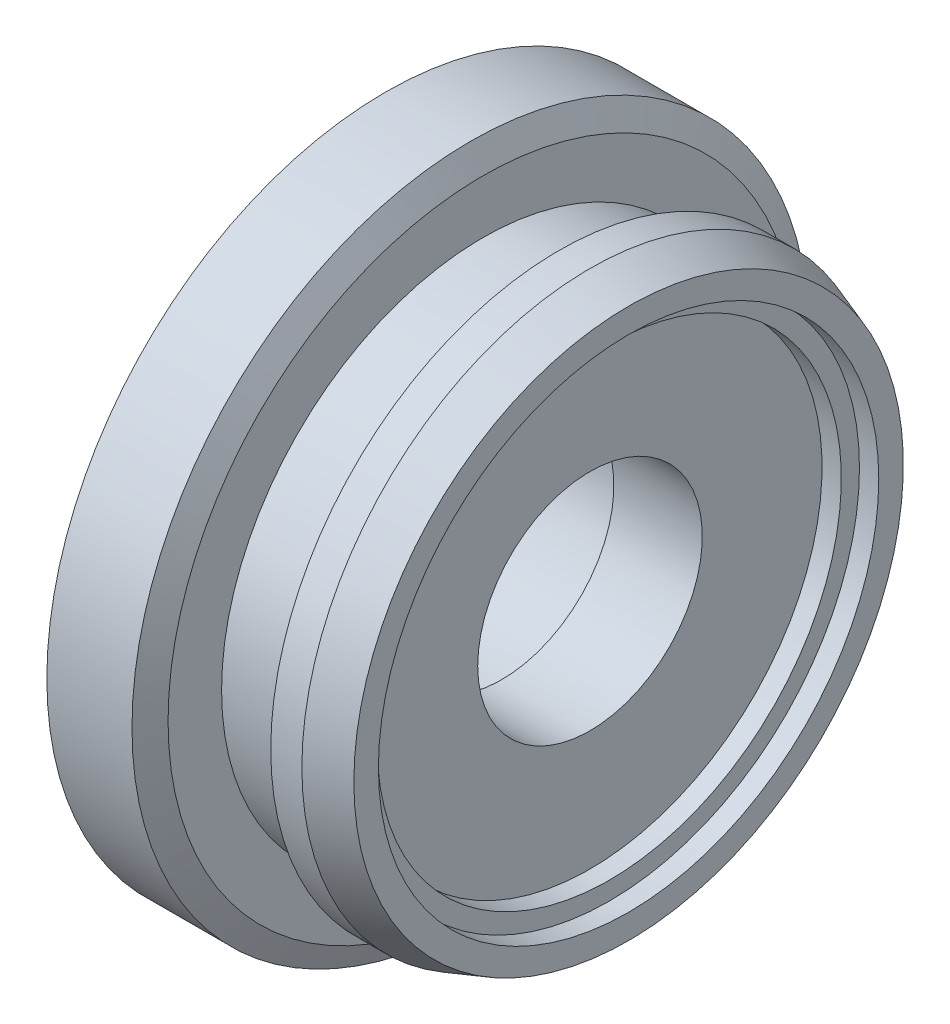
ISO-10303-21;
HEADER;
FILE_DESCRIPTION(('STEP AP214'),'2;1');
FILE_NAME('part.step','',(''),(''),'','','');
FILE_SCHEMA(('AUTOMOTIVE_DESIGN { 1 0 10303 214 1 1 1 1 }'));
ENDSEC;
DATA;
#1=APPLICATION_CONTEXT('core data for automotive mechanical design processes');
#2=APPLICATION_PROTOCOL_DEFINITION('international standard','automotive_design',2000,#1);
#3=PRODUCT_CONTEXT('',#1,'mechanical');
#4=PRODUCT('Part','Part','',(#3));
#5=PRODUCT_RELATED_PRODUCT_CATEGORY('part','',(#4));
#6=PRODUCT_DEFINITION_FORMATION('','',#4);
#7=PRODUCT_DEFINITION_CONTEXT('part definition',#1,'design');
#8=PRODUCT_DEFINITION('design','',#6,#7);
#9=PRODUCT_DEFINITION_SHAPE('','',#8);
#10=(LENGTH_UNIT() NAMED_UNIT(*) SI_UNIT(.MILLI.,.METRE.));
#11=(NAMED_UNIT(*) PLANE_ANGLE_UNIT() SI_UNIT($,.RADIAN.));
#12=(NAMED_UNIT(*) SI_UNIT($,.STERADIAN.) SOLID_ANGLE_UNIT());
#13=UNCERTAINTY_MEASURE_WITH_UNIT(LENGTH_MEASURE(1.E-05),#10,'distance_accuracy_value','');
#14=(GEOMETRIC_REPRESENTATION_CONTEXT(3) GLOBAL_UNCERTAINTY_ASSIGNED_CONTEXT((#13)) GLOBAL_UNIT_ASSIGNED_CONTEXT((#10,
#11,#12)) REPRESENTATION_CONTEXT('',''));
#15=CARTESIAN_POINT('',(0.,0.,0.));
#16=DIRECTION('',(0.,0.,1.));
#17=DIRECTION('',(1.,0.,0.));
#18=AXIS2_PLACEMENT_3D('',#15,#16,#17);
#19=CARTESIAN_POINT('',(0.,0.,0.));
#20=DIRECTION('',(-1.,0.,0.));
#21=DIRECTION('',(0.,0.,1.));
#22=AXIS2_PLACEMENT_3D('',#19,#20,#21);
#23=CYLINDRICAL_SURFACE('',#22,72.3211822660099);
#24=CARTESIAN_POINT('',(-3.51851386497515,0.,0.));
#25=DIRECTION('',(-1.,0.,0.));
#26=DIRECTION('',(0.,0.,1.));
#27=AXIS2_PLACEMENT_3D('',#24,#25,#26);
#28=CIRCLE('',#27,72.3211822660099);
#29=CARTESIAN_POINT('',(-3.51851386497515,0.,72.3211822660099));
#30=VERTEX_POINT('',#29);
#31=EDGE_CURVE('E81',#30,#30,#28,.T.);
#32=ORIENTED_EDGE('',*,*,#31,.F.);
#33=EDGE_LOOP('',(#32));
#34=FACE_BOUND('',#33,.T.);
#35=CARTESIAN_POINT('',(14.6638008523828,0.,0.));
#36=DIRECTION('',(-1.,0.,0.));
#37=DIRECTION('',(0.,0.,1.));
#38=AXIS2_PLACEMENT_3D('',#35,#36,#37);
#39=CIRCLE('',#38,72.3211822660099);
#40=CARTESIAN_POINT('',(14.6638008523828,0.,72.3211822660099));
#41=VERTEX_POINT('',#40);
#42=EDGE_CURVE('E10',#41,#41,#39,.T.);
#43=ORIENTED_EDGE('',*,*,#42,.T.);
#44=EDGE_LOOP('',(#43));
#45=FACE_BOUND('',#44,.T.);
#46=ADVANCED_FACE('F29',(#34,#45),#23,.T.);
#47=CARTESIAN_POINT('',(17.3226678474567,0.,0.));
#48=DIRECTION('',(-1.,0.,0.));
#49=DIRECTION('',(0.,0.,1.));
#50=AXIS2_PLACEMENT_3D('',#47,#48,#49);
#51=CONICAL_SURFACE('',#50,67.2693349753695,1.08631839775787);
#52=ORIENTED_EDGE('',*,*,#42,.F.);
#53=EDGE_LOOP('',(#52));
#54=FACE_BOUND('',#53,.T.);
#55=CARTESIAN_POINT('',(17.3226678474567,0.,0.));
#56=DIRECTION('',(-1.,0.,0.));
#57=DIRECTION('',(0.,0.,1.));
#58=AXIS2_PLACEMENT_3D('',#55,#56,#57);
#59=CIRCLE('',#58,67.2693349753695);
#60=CARTESIAN_POINT('',(17.3226678474567,0.,67.2693349753695));
#61=VERTEX_POINT('',#60);
#62=EDGE_CURVE('E35',#61,#61,#59,.T.);
#63=ORIENTED_EDGE('',*,*,#62,.T.);
#64=EDGE_LOOP('',(#63));
#65=FACE_BOUND('',#64,.T.);
#66=ADVANCED_FACE('F88',(#54,#65),#51,.T.);
#67=CARTESIAN_POINT('',(17.3226678474567,67.2693349753695,0.));
#68=DIRECTION('',(-1.,0.,0.));
#69=DIRECTION('',(0.,0.,1.));
#70=AXIS2_PLACEMENT_3D('',#67,#68,#69);
#71=PLANE('',#70);
#72=ORIENTED_EDGE('',*,*,#62,.F.);
#73=EDGE_LOOP('',(#72));
#74=FACE_BOUND('',#73,.T.);
#75=CARTESIAN_POINT('',(17.3226678474567,0.,0.));
#76=DIRECTION('',(-1.,0.,0.));
#77=DIRECTION('',(0.,0.,1.));
#78=AXIS2_PLACEMENT_3D('',#75,#76,#77);
#79=CIRCLE('',#78,55.8362068965517);
#80=CARTESIAN_POINT('',(17.3226678474567,0.,55.8362068965517));
#81=VERTEX_POINT('',#80);
#82=EDGE_CURVE('E39',#81,#81,#79,.T.);
#83=ORIENTED_EDGE('',*,*,#82,.T.);
#84=EDGE_LOOP('',(#83));
#85=FACE_BOUND('',#84,.T.);
#86=ADVANCED_FACE('F92',(#74,#85),#71,.F.);
#87=CARTESIAN_POINT('',(0.,0.,0.));
#88=DIRECTION('',(-1.,0.,0.));
#89=DIRECTION('',(0.,0.,1.));
#90=AXIS2_PLACEMENT_3D('',#87,#88,#89);
#91=CYLINDRICAL_SURFACE('',#90,55.8362068965517);
#92=ORIENTED_EDGE('',*,*,#82,.F.);
#93=EDGE_LOOP('',(#92));
#94=FACE_BOUND('',#93,.T.);
#95=CARTESIAN_POINT('',(33.5417565174074,0.,0.));
#96=DIRECTION('',(-1.,0.,0.));
#97=DIRECTION('',(0.,0.,1.));
#98=AXIS2_PLACEMENT_3D('',#95,#96,#97);
#99=CIRCLE('',#98,55.8362068965517);
#100=CARTESIAN_POINT('',(33.5417565174074,0.,55.8362068965517));
#101=VERTEX_POINT('',#100);
#102=EDGE_CURVE('E43',#101,#101,#99,.T.);
#103=ORIENTED_EDGE('',*,*,#102,.T.);
#104=EDGE_LOOP('',(#103));
#105=FACE_BOUND('',#104,.T.);
#106=ADVANCED_FACE('F97',(#94,#105),#91,.T.);
#107=CARTESIAN_POINT('',(33.5417565174074,55.8362068965517,0.));
#108=DIRECTION('',(1.,0.,0.));
#109=DIRECTION('',(0.,0.,-1.));
#110=AXIS2_PLACEMENT_3D('',#107,#108,#109);
#111=PLANE('',#110);
#112=ORIENTED_EDGE('',*,*,#102,.F.);
#113=EDGE_LOOP('',(#112));
#114=FACE_BOUND('',#113,.T.);
#115=CARTESIAN_POINT('',(33.5417565174074,0.,0.));
#116=DIRECTION('',(-1.,0.,0.));
#117=DIRECTION('',(0.,0.,1.));
#118=AXIS2_PLACEMENT_3D('',#115,#116,#117);
#119=CIRCLE('',#118,61.5527709359606);
#120=CARTESIAN_POINT('',(33.5417565174074,0.,61.5527709359606));
#121=VERTEX_POINT('',#120);
#122=EDGE_CURVE('E48',#121,#121,#119,.T.);
#123=ORIENTED_EDGE('',*,*,#122,.T.);
#124=EDGE_LOOP('',(#123));
#125=FACE_BOUND('',#124,.T.);
#126=ADVANCED_FACE('F103',(#114,#125),#111,.F.);
#127=CARTESIAN_POINT('',(0.,0.,0.));
#128=DIRECTION('',(-1.,0.,0.));
#129=DIRECTION('',(0.,0.,1.));
#130=AXIS2_PLACEMENT_3D('',#127,#128,#129);
#131=CYLINDRICAL_SURFACE('',#130,61.5527709359606);
#132=ORIENTED_EDGE('',*,*,#122,.F.);
#133=EDGE_LOOP('',(#132));
#134=FACE_BOUND('',#133,.T.);
#135=CARTESIAN_POINT('',(40.1889240050922,0.,0.));
#136=DIRECTION('',(-1.,0.,0.));
#137=DIRECTION('',(0.,0.,1.));
#138=AXIS2_PLACEMENT_3D('',#135,#136,#137);
#139=CIRCLE('',#138,61.5527709359606);
#140=CARTESIAN_POINT('',(40.1889240050922,0.,61.5527709359606));
#141=VERTEX_POINT('',#140);
#142=EDGE_CURVE('E51',#141,#141,#139,.T.);
#143=ORIENTED_EDGE('',*,*,#142,.T.);
#144=EDGE_LOOP('',(#143));
#145=FACE_BOUND('',#144,.T.);
#146=ADVANCED_FACE('F107',(#134,#145),#131,.T.);
#147=CARTESIAN_POINT('',(48.4314116898212,0.,0.));
#148=DIRECTION('',(-1.,0.,0.));
#149=DIRECTION('',(0.,0.,1.));
#150=AXIS2_PLACEMENT_3D('',#147,#148,#149);
#151=CONICAL_SURFACE('',#150,58.6944889162562,0.333798164250827);
#152=ORIENTED_EDGE('',*,*,#142,.F.);
#153=EDGE_LOOP('',(#152));
#154=FACE_BOUND('',#153,.T.);
#155=CARTESIAN_POINT('',(48.4314116898212,0.,0.));
#156=DIRECTION('',(-1.,0.,0.));
#157=DIRECTION('',(0.,0.,1.));
#158=AXIS2_PLACEMENT_3D('',#155,#156,#157);
#159=CIRCLE('',#158,58.6944889162562);
#160=CARTESIAN_POINT('',(48.4314116898212,0.,58.6944889162562));
#161=VERTEX_POINT('',#160);
#162=EDGE_CURVE('E54',#161,#161,#159,.T.);
#163=ORIENTED_EDGE('',*,*,#162,.T.);
#164=EDGE_LOOP('',(#163));
#165=FACE_BOUND('',#164,.T.);
#166=ADVANCED_FACE('F111',(#154,#165),#151,.T.);
#167=CARTESIAN_POINT('',(48.4314116898212,58.6944889162562,0.));
#168=DIRECTION('',(-1.,0.,0.));
#169=DIRECTION('',(0.,0.,1.));
#170=AXIS2_PLACEMENT_3D('',#167,#168,#169);
#171=PLANE('',#170);
#172=ORIENTED_EDGE('',*,*,#162,.F.);
#173=EDGE_LOOP('',(#172));
#174=FACE_BOUND('',#173,.T.);
#175=CARTESIAN_POINT('',(48.4314116898212,0.,0.));
#176=DIRECTION('',(-1.,0.,0.));
#177=DIRECTION('',(0.,0.,1.));
#178=AXIS2_PLACEMENT_3D('',#175,#176,#177);
#179=CIRCLE('',#178,53.4432266009852);
#180=CARTESIAN_POINT('',(48.4314116898212,0.,53.4432266009852));
#181=VERTEX_POINT('',#180);
#182=EDGE_CURVE('E57',#181,#181,#179,.T.);
#183=ORIENTED_EDGE('',*,*,#182,.T.);
#184=EDGE_LOOP('',(#183));
#185=FACE_BOUND('',#184,.T.);
#186=ADVANCED_FACE('F115',(#174,#185),#171,.F.);
#187=CARTESIAN_POINT('',(0.,0.,0.));
#188=DIRECTION('',(-1.,0.,0.));
#189=DIRECTION('',(0.,0.,1.));
#190=AXIS2_PLACEMENT_3D('',#187,#188,#189);
#191=CYLINDRICAL_SURFACE('',#190,53.4432266009852);
#192=ORIENTED_EDGE('',*,*,#182,.F.);
#193=EDGE_LOOP('',(#192));
#194=FACE_BOUND('',#193,.T.);
#195=CARTESIAN_POINT('',(44.3101678474567,0.,0.));
#196=DIRECTION('',(-1.,0.,0.));
#197=DIRECTION('',(0.,0.,1.));
#198=AXIS2_PLACEMENT_3D('',#195,#196,#197);
#199=CIRCLE('',#198,53.4432266009852);
#200=CARTESIAN_POINT('',(44.3101678474567,0.,53.4432266009852));
#201=VERTEX_POINT('',#200);
#202=EDGE_CURVE('E60',#201,#201,#199,.T.);
#203=ORIENTED_EDGE('',*,*,#202,.T.);
#204=EDGE_LOOP('',(#203));
#205=FACE_BOUND('',#204,.T.);
#206=ADVANCED_FACE('F119',(#194,#205),#191,.F.);
#207=CARTESIAN_POINT('',(44.3101678474567,53.4432266009852,0.));
#208=DIRECTION('',(-1.,0.,0.));
#209=DIRECTION('',(0.,0.,1.));
#210=AXIS2_PLACEMENT_3D('',#207,#208,#209);
#211=PLANE('',#210);
#212=ORIENTED_EDGE('',*,*,#202,.F.);
#213=EDGE_LOOP('',(#212));
#214=FACE_BOUND('',#213,.T.);
#215=CARTESIAN_POINT('',(44.3101678474567,0.,0.));
#216=DIRECTION('',(-1.,0.,0.));
#217=DIRECTION('',(0.,0.,1.));
#218=AXIS2_PLACEMENT_3D('',#215,#216,#217);
#219=CIRCLE('',#218,49.5683393946803);
#220=CARTESIAN_POINT('',(44.3101678474567,0.,49.5683393946803));
#221=VERTEX_POINT('',#220);
#222=EDGE_CURVE('E63',#221,#221,#219,.T.);
#223=ORIENTED_EDGE('',*,*,#222,.T.);
#224=EDGE_LOOP('',(#223));
#225=FACE_BOUND('',#224,.T.);
#226=ADVANCED_FACE('F123',(#214,#225),#211,.F.);
#227=CARTESIAN_POINT('',(0.,0.,0.));
#228=DIRECTION('',(-1.,0.,0.));
#229=DIRECTION('',(0.,0.,1.));
#230=AXIS2_PLACEMENT_3D('',#227,#228,#229);
#231=CYLINDRICAL_SURFACE('',#230,49.5683393946803);
#232=ORIENTED_EDGE('',*,*,#222,.F.);
#233=EDGE_LOOP('',(#232));
#234=FACE_BOUND('',#233,.T.);
#235=CARTESIAN_POINT('',(40.1889240050922,0.,0.));
#236=DIRECTION('',(-1.,0.,0.));
#237=DIRECTION('',(0.,0.,1.));
#238=AXIS2_PLACEMENT_3D('',#235,#236,#237);
#239=CIRCLE('',#238,49.5683393946803);
#240=CARTESIAN_POINT('',(40.1889240050922,0.,49.5683393946803));
#241=VERTEX_POINT('',#240);
#242=EDGE_CURVE('E66',#241,#241,#239,.T.);
#243=ORIENTED_EDGE('',*,*,#242,.T.);
#244=EDGE_LOOP('',(#243));
#245=FACE_BOUND('',#244,.T.);
#246=ADVANCED_FACE('F127',(#234,#245),#231,.F.);
#247=CARTESIAN_POINT('',(40.1889240050922,49.5683393946803,0.));
#248=DIRECTION('',(-1.,0.,0.));
#249=DIRECTION('',(0.,0.,1.));
#250=AXIS2_PLACEMENT_3D('',#247,#248,#249);
#251=PLANE('',#250);
#252=ORIENTED_EDGE('',*,*,#242,.F.);
#253=EDGE_LOOP('',(#252));
#254=FACE_BOUND('',#253,.T.);
#255=CARTESIAN_POINT('',(40.1889240050922,0.,0.));
#256=DIRECTION('',(-1.,0.,0.));
#257=DIRECTION('',(0.,0.,1.));
#258=AXIS2_PLACEMENT_3D('',#255,#256,#257);
#259=CIRCLE('',#258,23.9900361885631);
#260=CARTESIAN_POINT('',(40.1889240050922,0.,23.9900361885631));
#261=VERTEX_POINT('',#260);
#262=EDGE_CURVE('E69',#261,#261,#259,.T.);
#263=ORIENTED_EDGE('',*,*,#262,.T.);
#264=EDGE_LOOP('',(#263));
#265=FACE_BOUND('',#264,.T.);
#266=ADVANCED_FACE('F131',(#254,#265),#251,.F.);
#267=CARTESIAN_POINT('',(0.,0.,0.));
#268=DIRECTION('',(-1.,0.,0.));
#269=DIRECTION('',(0.,0.,1.));
#270=AXIS2_PLACEMENT_3D('',#267,#268,#269);
#271=CYLINDRICAL_SURFACE('',#270,23.9900361885631);
#272=ORIENTED_EDGE('',*,*,#262,.F.);
#273=EDGE_LOOP('',(#272));
#274=FACE_BOUND('',#273,.T.);
#275=CARTESIAN_POINT('',(21.3037375685873,0.,0.));
#276=DIRECTION('',(-1.,0.,0.));
#277=DIRECTION('',(0.,0.,1.));
#278=AXIS2_PLACEMENT_3D('',#275,#276,#277);
#279=CIRCLE('',#278,23.9900361885631);
#280=CARTESIAN_POINT('',(21.3037375685873,0.,23.9900361885631));
#281=VERTEX_POINT('',#280);
#282=EDGE_CURVE('E72',#281,#281,#279,.T.);
#283=ORIENTED_EDGE('',*,*,#282,.T.);
#284=EDGE_LOOP('',(#283));
#285=FACE_BOUND('',#284,.T.);
#286=ADVANCED_FACE('F135',(#274,#285),#271,.F.);
#287=CARTESIAN_POINT('',(19.2053660264421,0.,0.));
#288=DIRECTION('',(-1.,0.,0.));
#289=DIRECTION('',(0.,0.,1.));
#290=AXIS2_PLACEMENT_3D('',#287,#288,#289);
#291=CONICAL_SURFACE('',#290,27.9769421186389,1.08631839775787);
#292=ORIENTED_EDGE('',*,*,#282,.F.);
#293=EDGE_LOOP('',(#292));
#294=FACE_BOUND('',#293,.T.);
#295=CARTESIAN_POINT('',(19.2053660264421,0.,0.));
#296=DIRECTION('',(-1.,0.,0.));
#297=DIRECTION('',(0.,0.,1.));
#298=AXIS2_PLACEMENT_3D('',#295,#296,#297);
#299=CIRCLE('',#298,27.9769421186389);
#300=CARTESIAN_POINT('',(19.2053660264421,0.,27.9769421186389));
#301=VERTEX_POINT('',#300);
#302=EDGE_CURVE('E75',#301,#301,#299,.T.);
#303=ORIENTED_EDGE('',*,*,#302,.T.);
#304=EDGE_LOOP('',(#303));
#305=FACE_BOUND('',#304,.T.);
#306=ADVANCED_FACE('F139',(#294,#305),#291,.F.);
#307=CARTESIAN_POINT('',(0.,0.,0.));
#308=DIRECTION('',(-1.,0.,0.));
#309=DIRECTION('',(0.,0.,1.));
#310=AXIS2_PLACEMENT_3D('',#307,#308,#309);
#311=CYLINDRICAL_SURFACE('',#310,27.9769421186389);
#312=ORIENTED_EDGE('',*,*,#302,.F.);
#313=EDGE_LOOP('',(#312));
#314=FACE_BOUND('',#313,.T.);
#315=CARTESIAN_POINT('',(-3.51851386497515,0.,0.));
#316=DIRECTION('',(-1.,0.,0.));
#317=DIRECTION('',(0.,0.,1.));
#318=AXIS2_PLACEMENT_3D('',#315,#316,#317);
#319=CIRCLE('',#318,27.9769421186389);
#320=CARTESIAN_POINT('',(-3.51851386497515,0.,27.9769421186389));
#321=VERTEX_POINT('',#320);
#322=EDGE_CURVE('E78',#321,#321,#319,.T.);
#323=ORIENTED_EDGE('',*,*,#322,.T.);
#324=EDGE_LOOP('',(#323));
#325=FACE_BOUND('',#324,.T.);
#326=ADVANCED_FACE('F143',(#314,#325),#311,.F.);
#327=CARTESIAN_POINT('',(-3.51851386497515,27.9769421186389,0.));
#328=DIRECTION('',(1.,0.,0.));
#329=DIRECTION('',(0.,0.,-1.));
#330=AXIS2_PLACEMENT_3D('',#327,#328,#329);
#331=PLANE('',#330);
#332=ORIENTED_EDGE('',*,*,#322,.F.);
#333=EDGE_LOOP('',(#332));
#334=FACE_BOUND('',#333,.T.);
#335=ORIENTED_EDGE('',*,*,#31,.T.);
#336=EDGE_LOOP('',(#335));
#337=FACE_BOUND('',#336,.T.);
#338=ADVANCED_FACE('F85',(#334,#337),#331,.F.);
#339=CLOSED_SHELL('',(#46,#66,#86,#106,#126,#146,#166,#186,#206,#226,#246,#266,#286,#306,#326,#338));
#340=MANIFOLD_SOLID_BREP('B2',#339);
#341=ADVANCED_BREP_SHAPE_REPRESENTATION('',(#18,#340),#14);
#342=SHAPE_DEFINITION_REPRESENTATION(#9,#341);
ENDSEC;
END-ISO-10303-21;
